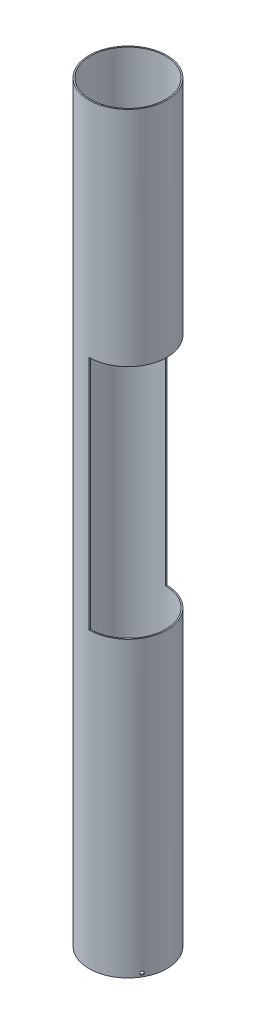
ISO-10303-21;
HEADER;
FILE_DESCRIPTION(('STEP AP214'),'2;1');
FILE_NAME('part.step','',(''),(''),'','','');
FILE_SCHEMA(('AUTOMOTIVE_DESIGN { 1 0 10303 214 1 1 1 1 }'));
ENDSEC;
DATA;
#1=APPLICATION_CONTEXT('core data for automotive mechanical design processes');
#2=APPLICATION_PROTOCOL_DEFINITION('international standard','automotive_design',2000,#1);
#3=PRODUCT_CONTEXT('',#1,'mechanical');
#4=PRODUCT('Part','Part','',(#3));
#5=PRODUCT_RELATED_PRODUCT_CATEGORY('part','',(#4));
#6=PRODUCT_DEFINITION_FORMATION('','',#4);
#7=PRODUCT_DEFINITION_CONTEXT('part definition',#1,'design');
#8=PRODUCT_DEFINITION('design','',#6,#7);
#9=PRODUCT_DEFINITION_SHAPE('','',#8);
#10=(LENGTH_UNIT() NAMED_UNIT(*) SI_UNIT(.MILLI.,.METRE.));
#11=(NAMED_UNIT(*) PLANE_ANGLE_UNIT() SI_UNIT($,.RADIAN.));
#12=(NAMED_UNIT(*) SI_UNIT($,.STERADIAN.) SOLID_ANGLE_UNIT());
#13=UNCERTAINTY_MEASURE_WITH_UNIT(LENGTH_MEASURE(1.E-05),#10,'distance_accuracy_value','');
#14=(GEOMETRIC_REPRESENTATION_CONTEXT(3) GLOBAL_UNCERTAINTY_ASSIGNED_CONTEXT((#13)) GLOBAL_UNIT_ASSIGNED_CONTEXT((#10,
#11,#12)) REPRESENTATION_CONTEXT('',''));
#15=CARTESIAN_POINT('',(0.,0.,0.));
#16=DIRECTION('',(0.,0.,1.));
#17=DIRECTION('',(1.,0.,0.));
#18=AXIS2_PLACEMENT_3D('',#15,#16,#17);
#19=CARTESIAN_POINT('',(0.,762.,0.));
#20=DIRECTION('',(0.,-1.,0.));
#21=DIRECTION('',(0.,0.,-1.));
#22=AXIS2_PLACEMENT_3D('',#19,#20,#21);
#23=CYLINDRICAL_SURFACE('',#22,39.37);
#24=CARTESIAN_POINT('',(0.,0.,0.));
#25=DIRECTION('',(0.,1.,0.));
#26=DIRECTION('',(0.,0.,1.));
#27=AXIS2_PLACEMENT_3D('',#24,#25,#26);
#28=CIRCLE('',#27,39.37);
#29=CARTESIAN_POINT('',(0.,0.,39.37));
#30=VERTEX_POINT('',#29);
#31=EDGE_CURVE('E172',#30,#30,#28,.T.);
#32=ORIENTED_EDGE('',*,*,#31,.T.);
#33=EDGE_LOOP('',(#32));
#34=FACE_BOUND('',#33,.T.);
#35=CARTESIAN_POINT('',(0.,762.,0.));
#36=DIRECTION('',(0.,1.,0.));
#37=DIRECTION('',(0.,0.,1.));
#38=AXIS2_PLACEMENT_3D('',#35,#36,#37);
#39=CIRCLE('',#38,39.37);
#40=CARTESIAN_POINT('',(0.,762.,39.37));
#41=VERTEX_POINT('',#40);
#42=EDGE_CURVE('E176',#41,#41,#39,.T.);
#43=ORIENTED_EDGE('',*,*,#42,.F.);
#44=EDGE_LOOP('',(#43));
#45=FACE_BOUND('',#44,.T.);
#46=CARTESIAN_POINT('',(0.,4.98001203184509,-39.37));
#47=CARTESIAN_POINT('',(-0.0950420783106642,4.98000783183179,-39.3699995116633));
#48=CARTESIAN_POINT('',(-0.19015195208346,4.97198129213131,-39.3696521537289));
#49=CARTESIAN_POINT('',(-0.377749092701281,4.94007502605946,-39.3682998672944));
#50=CARTESIAN_POINT('',(-0.470233116585823,4.91617651595078,-39.3672941596883));
#51=CARTESIAN_POINT('',(-0.649833808346389,4.85321079913397,-39.36473902938));
#52=CARTESIAN_POINT('',(-0.736953141689522,4.81415119689102,-39.3631898792939));
#53=CARTESIAN_POINT('',(-0.90337461556956,4.72198342848802,-39.3597224451632));
#54=CARTESIAN_POINT('',(-0.98267862079702,4.66887862462239,-39.3578042494948));
#55=CARTESIAN_POINT('',(-1.13130445742555,4.55008091395807,-39.3538129080837));
#56=CARTESIAN_POINT('',(-1.20061945247711,4.48437945716689,-39.3517396576837));
#57=CARTESIAN_POINT('',(-1.3272415925757,4.34227003364836,-39.3476727832543));
#58=CARTESIAN_POINT('',(-1.38454825216813,4.26586163428542,-39.3456791624467));
#59=CARTESIAN_POINT('',(-1.48554392473161,4.10447388206962,-39.3419956723313));
#60=CARTESIAN_POINT('',(-1.52922789130311,4.01949136840869,-39.340305915685));
#61=CARTESIAN_POINT('',(-1.60170568623785,3.84339004313634,-39.3374219044769));
#62=CARTESIAN_POINT('',(-1.63049960587457,3.75227126914304,-39.3362276468776));
#63=CARTESIAN_POINT('',(-1.67236268409085,3.56654421262905,-39.3344702061846));
#64=CARTESIAN_POINT('',(-1.68544164712472,3.47193814382548,-39.3339066296283));
#65=CARTESIAN_POINT('',(-1.69553378679414,3.28187174755947,-39.3334729195219));
#66=CARTESIAN_POINT('',(-1.69254706470368,3.1864114254858,-39.3336027816005));
#67=CARTESIAN_POINT('',(-1.67060081093584,2.99741286670702,-39.3345409385238));
#68=CARTESIAN_POINT('',(-1.65165186894738,2.90387339780013,-39.3353487835783));
#69=CARTESIAN_POINT('',(-1.59833546790773,2.72130431420434,-39.3375511396038));
#70=CARTESIAN_POINT('',(-1.56396795637497,2.63227471486722,-39.3389456525716));
#71=CARTESIAN_POINT('',(-1.4807778608903,2.46121846161553,-39.3421646783245));
#72=CARTESIAN_POINT('',(-1.43195043808114,2.37919416380863,-39.3439893350109));
#73=CARTESIAN_POINT('',(-1.32123009378693,2.22450267013418,-39.3478628287787));
#74=CARTESIAN_POINT('',(-1.25933710545153,2.15183552214581,-39.349911667007));
#75=CARTESIAN_POINT('',(-1.12418272987786,2.0178594309771,-39.3540045835823));
#76=CARTESIAN_POINT('',(-1.05091216873308,1.9565597418437,-39.3560486567252));
#77=CARTESIAN_POINT('',(-0.89511481475696,1.8471299233649,-39.3599000384661));
#78=CARTESIAN_POINT('',(-0.81258802000479,1.79899979675243,-39.3617073470151));
#79=CARTESIAN_POINT('',(-0.64061552136329,1.71727628329349,-39.3648815506819));
#80=CARTESIAN_POINT('',(-0.551169669949889,1.68368320649822,-39.3662484364061));
#81=CARTESIAN_POINT('',(-0.367900459757485,1.63199336734538,-39.3683875892833));
#82=CARTESIAN_POINT('',(-0.274077125262604,1.61389651903312,-39.3691598597346));
#83=CARTESIAN_POINT('',(-0.0847966155301952,1.59372421854097,-39.3700223156438));
#84=CARTESIAN_POINT('',(0.0106591929554708,1.59163596412215,-39.3701130461352));
#85=CARTESIAN_POINT('',(0.200565637148675,1.60350673879702,-39.3696036416406));
#86=CARTESIAN_POINT('',(0.295016275300036,1.61746572886681,-39.3690035083348));
#87=CARTESIAN_POINT('',(0.480195476070679,1.66102415267996,-39.3671803383439));
#88=CARTESIAN_POINT('',(0.570925413063392,1.69061775410989,-39.3659575339454));
#89=CARTESIAN_POINT('',(0.746130008305633,1.76459943479582,-39.3630267413466));
#90=CARTESIAN_POINT('',(0.830604640035484,1.80898757676962,-39.3613187510894));
#91=CARTESIAN_POINT('',(0.990959546892861,1.91133117994094,-39.3576084769163));
#92=CARTESIAN_POINT('',(1.06683433136313,1.96929523721227,-39.3556060068403));
#93=CARTESIAN_POINT('',(1.20778055703025,2.09713270074688,-39.3515329775977));
#94=CARTESIAN_POINT('',(1.27285194594558,2.16700616464075,-39.3494624181017));
#95=CARTESIAN_POINT('',(1.39038720966608,2.31673398284631,-39.3454850513226));
#96=CARTESIAN_POINT('',(1.44284281120277,2.39659483486953,-39.3435783520206));
#97=CARTESIAN_POINT('',(1.53360094179633,2.56399753766406,-39.3401453943536));
#98=CARTESIAN_POINT('',(1.57190352041913,2.65153936153417,-39.3386191346563));
#99=CARTESIAN_POINT('',(1.63325387152443,2.83178816474908,-39.3361199248937));
#100=CARTESIAN_POINT('',(1.65630694977704,2.9244933354223,-39.3351467823986));
#101=CARTESIAN_POINT('',(1.68652127447177,3.11246268625176,-39.33386299577));
#102=CARTESIAN_POINT('',(1.69368258004302,3.20772685688532,-39.3335523491714));
#103=CARTESIAN_POINT('',(1.69190946940816,3.39802755639757,-39.333628650755));
#104=CARTESIAN_POINT('',(1.68298807591869,3.49306420711711,-39.3340150345277));
#105=CARTESIAN_POINT('',(1.64932968820657,3.68028926657918,-39.3354406540112));
#106=CARTESIAN_POINT('',(1.62459266328724,3.77247766979317,-39.3364798909891));
#107=CARTESIAN_POINT('',(1.56000766284437,3.9513926152622,-39.3390939598741));
#108=CARTESIAN_POINT('',(1.52015950497137,4.03811909159221,-39.3406687982445));
#109=CARTESIAN_POINT('',(1.42648607612367,4.20365089531175,-39.3441765014396));
#110=CARTESIAN_POINT('',(1.37266126509872,4.28245648324695,-39.3461093544819));
#111=CARTESIAN_POINT('',(1.25251738996995,4.42997353540114,-39.3501169655678));
#112=CARTESIAN_POINT('',(1.18618958482348,4.49867787750174,-39.3521918222379));
#113=CARTESIAN_POINT('',(1.0429219433514,4.6239967145901,-39.3562490325377));
#114=CARTESIAN_POINT('',(0.965979493562689,4.68060822339067,-39.3582313632249));
#115=CARTESIAN_POINT('',(0.803618694279619,4.78015395567005,-39.3618812018049));
#116=CARTESIAN_POINT('',(0.718193353798812,4.82307677316331,-39.3635484466865));
#117=CARTESIAN_POINT('',(0.541406294233834,4.89392001699157,-39.3663760344494));
#118=CARTESIAN_POINT('',(0.450051759273257,4.92185823262782,-39.3675369780901));
#119=CARTESIAN_POINT('',(0.298438107295841,4.95458011910427,-39.3689127721565));
#120=CARTESIAN_POINT('',(0.239161885859798,4.96410498233784,-39.3693187000876));
#121=CARTESIAN_POINT('',(0.119932776340874,4.97682226203223,-39.3698624680178));
#122=CARTESIAN_POINT('',(0.0599798886778428,4.98001468242191,-39.3700003081833));
#123=CARTESIAN_POINT('',(0.,4.98001203184509,-39.37));
#124=B_SPLINE_CURVE_WITH_KNOTS('',3,(#46,#47,#48,#49,#50,#51,#52,#53,#54,#55,#56,#57,#58,#59,
#60,#61,#62,#63,#64,#65,#66,#67,#68,#69,#70,#71,#72,#73,#74,#75,#76,#77,#78,#79,#80,#81,#82,#83,
#84,#85,#86,#87,#88,#89,#90,#91,#92,#93,#94,#95,#96,#97,#98,#99,#100,#101,#102,#103,#104,#105,
#106,#107,#108,#109,#110,#111,#112,#113,#114,#115,#116,#117,#118,#119,#120,#121,#122,#123),
.UNSPECIFIED.,.T.,.F.,(4,2,2,2,2,2,2,2,2,2,2,2,2,2,2,2,2,2,2,2,2,2,2,2,2,2,2,2,2,2,2,2,2,2,2,2,
2,2,4),(0.,0.284907291951242,0.570152360661547,0.855254541313081,1.14028853275696,
1.42551668068289,1.71075635715183,1.99610157282346,2.28144503935619,2.56661038945319,
2.85177394194247,3.1367484594956,3.42172394704963,3.70679490662229,3.99186732480409,
4.27717080625707,4.56247434691592,4.84778397232727,5.13309201516931,5.4181718703784,
5.70325103232804,5.98822392376052,6.2731980232806,6.55835305445107,6.84350946554916,
7.12885237168492,7.41419427849897,7.69943685379749,7.98467836778141,8.26968901560107,
8.55470021660186,8.83971485700698,9.12472011921539,9.40992537713639,9.69520098203275,
9.98071367307523,10.2658866569249,10.4456882622863,10.6254897560929),.UNSPECIFIED.);
#125=CARTESIAN_POINT('',(0.,4.98001203184509,-39.37));
#126=VERTEX_POINT('',#125);
#127=EDGE_CURVE('E180',#126,#126,#124,.T.);
#128=ORIENTED_EDGE('',*,*,#127,.T.);
#129=EDGE_LOOP('',(#128));
#130=FACE_BOUND('',#129,.T.);
#131=CARTESIAN_POINT('',(33.2174512961359,3.28714288487833,21.1328613630251));
#132=CARTESIAN_POINT('',(33.2174538205479,3.38218491738494,21.1328579706893));
#133=CARTESIAN_POINT('',(33.2217681930752,3.47729474551065,21.126080633747));
#134=CARTESIAN_POINT('',(33.2388934445685,3.6648917912808,21.0991257570981));
#135=CARTESIAN_POINT('',(33.2517143907443,3.75737576592903,21.0789323399275));
#136=CARTESIAN_POINT('',(33.2854116163837,3.9369763536157,21.02568097877));
#137=CARTESIAN_POINT('',(33.3062838568314,4.02409563253836,20.9926294851009));
#138=CARTESIAN_POINT('',(33.3553720391397,4.19051701538223,20.9145445214253));
#139=CARTESIAN_POINT('',(33.3835862234407,4.26982098392493,20.8695139189942));
#140=CARTESIAN_POINT('',(33.4464423518298,4.4184468625803,20.7686282179428));
#141=CARTESIAN_POINT('',(33.4810886687199,4.48776192457972,20.7127657542666));
#142=CARTESIAN_POINT('',(33.5556650540467,4.61438419371642,20.5917285571402));
#143=CARTESIAN_POINT('',(33.5955953358989,4.67169091560414,20.5265534475506));
#144=CARTESIAN_POINT('',(33.6794779391566,4.77268665284044,20.3886285247867));
#145=CARTESIAN_POINT('',(33.7234317398689,4.81637063336175,20.3158759242693));
#146=CARTESIAN_POINT('',(33.8139783769478,4.88884845770009,20.1648087872665));
#147=CARTESIAN_POINT('',(33.8605711971658,4.91764239262118,20.0864942848148));
#148=CARTESIAN_POINT('',(33.9549554225056,4.95950550347214,19.9265279617717));
#149=CARTESIAN_POINT('',(34.0027460612068,4.97258448495485,19.8448782551491));
#150=CARTESIAN_POINT('',(34.0981544914141,4.98267667167345,19.680492633966));
#151=CARTESIAN_POINT('',(34.1457722840059,4.97968997798896,19.5977567262428));
#152=CARTESIAN_POINT('',(34.2394598912068,4.95774376868586,19.4336104076742));
#153=CARTESIAN_POINT('',(34.2855307083884,4.93879481417567,19.3521991566899));
#154=CARTESIAN_POINT('',(34.37490958429,4.88547833548628,19.1929891139188));
#155=CARTESIAN_POINT('',(34.4182176336554,4.85111075910423,19.1151903343637));
#156=CARTESIAN_POINT('',(34.5009596753003,4.76792053040032,18.9654425262297));
#157=CARTESIAN_POINT('',(34.5403923689781,4.71909305452594,18.8934954598974));
#158=CARTESIAN_POINT('',(34.6143845938184,4.60837259753722,18.7575924822923));
#159=CARTESIAN_POINT('',(34.6489441000329,4.5464795495389,18.6936366119299));
#160=CARTESIAN_POINT('',(34.7123875129296,4.4113251322666,18.5755634988489));
#161=CARTESIAN_POINT('',(34.7412668026752,4.33805460110622,18.5214542622221));
#162=CARTESIAN_POINT('',(34.7926452104451,4.18225733210706,18.4247590777228));
#163=CARTESIAN_POINT('',(34.8151443270767,4.09973059224792,18.3821731323654));
#164=CARTESIAN_POINT('',(34.8532555182368,3.92775810714328,18.3098105015829));
#165=CARTESIAN_POINT('',(34.8688674373111,3.83831220577562,18.2800341052886));
#166=CARTESIAN_POINT('',(34.8928583269078,3.6550428872034,18.2341989882741));
#167=CARTESIAN_POINT('',(34.9012373376876,3.56121949436637,18.2181401912038));
#168=CARTESIAN_POINT('',(34.9105758749707,3.37193895962708,18.2002389044854));
#169=CARTESIAN_POINT('',(34.9115413375262,3.27648318617466,18.1983850409036));
#170=CARTESIAN_POINT('',(34.9060474900208,3.08657681934583,18.208920411737));
#171=CARTESIAN_POINT('',(34.899588198014,2.99212622352577,18.2213096115186));
#172=CARTESIAN_POINT('',(34.879389207629,2.80694722254543,18.2599446463407));
#173=CARTESIAN_POINT('',(34.8656522323883,2.71621743881703,18.2861852984811));
#174=CARTESIAN_POINT('',(34.831201232923,2.54101313126621,18.3517215337401));
#175=CARTESIAN_POINT('',(34.8104871790039,2.45653863406829,18.391017172421));
#176=CARTESIAN_POINT('',(34.7625298844432,2.29618381557865,18.4815050721675));
#177=CARTESIAN_POINT('',(34.7352824952791,2.22030900015793,18.5327048914938));
#178=CARTESIAN_POINT('',(34.6748914378453,2.07936270340621,18.6454520636411));
#179=CARTESIAN_POINT('',(34.6417477411147,2.01429127422503,18.7069994664088));
#180=CARTESIAN_POINT('',(34.5703275693102,1.89675592818081,18.8386558243499));
#181=CARTESIAN_POINT('',(34.5320477514916,1.84430028467192,18.9087703525935));
#182=CARTESIAN_POINT('',(34.4513179067664,1.75354208033435,19.0554610035425));
#183=CARTESIAN_POINT('',(34.4088678944655,1.71523946993862,19.1320371036169));
#184=CARTESIAN_POINT('',(34.3209062996509,1.6538890967604,19.2893858168249));
#185=CARTESIAN_POINT('',(34.2753957908424,1.63083601447108,19.3701569559842));
#186=CARTESIAN_POINT('',(34.1825219936844,1.6006216620792,19.533584414318));
#187=CARTESIAN_POINT('',(34.1351587121937,1.59346033315357,19.6162407265134));
#188=CARTESIAN_POINT('',(34.0399423248748,1.59523337767018,19.7810078905008));
#189=CARTESIAN_POINT('',(33.9920896455457,1.60415475616211,19.8631191289154));
#190=CARTESIAN_POINT('',(33.8972434528362,1.63781315173865,20.0245487830765));
#191=CARTESIAN_POINT('',(33.850249941113,1.66255019932711,20.1038671934362));
#192=CARTESIAN_POINT('',(33.758530117058,1.72713528475596,20.2575061608741));
#193=CARTESIAN_POINT('',(33.7138038320892,1.76698350492273,20.3318266576365));
#194=CARTESIAN_POINT('',(33.6280015194782,1.86065709050227,20.4734285430828));
#195=CARTESIAN_POINT('',(33.5869253717463,1.91448199585274,20.540710163359));
#196=CARTESIAN_POINT('',(33.5096968051586,2.03462597249464,20.6664602377637));
#197=CARTESIAN_POINT('',(33.4735478530767,2.10095376341906,20.7249224896427));
#198=CARTESIAN_POINT('',(33.4073744260692,2.2442213476446,20.8314228152268));
#199=CARTESIAN_POINT('',(33.3773514640614,2.32116375456164,20.8794583140535));
#200=CARTESIAN_POINT('',(33.3244164552602,2.48352452120396,20.9638417046183));
#201=CARTESIAN_POINT('',(33.301510345427,2.56894987953958,21.0001798391867));
#202=CARTESIAN_POINT('',(33.2636383410865,2.74573697740927,21.0601171211081));
#203=CARTESIAN_POINT('',(33.2486630314987,2.83709153272086,21.0837313742503));
#204=CARTESIAN_POINT('',(33.2311096380607,2.98870513701385,21.1113808381931));
#205=CARTESIAN_POINT('',(33.2259953610197,3.04798128677177,21.1194264469216));
#206=CARTESIAN_POINT('',(33.2191653945528,3.16721025258049,21.1301677781028));
#207=CARTESIAN_POINT('',(33.2174497030117,3.22716306821015,21.132863503885));
#208=CARTESIAN_POINT('',(33.2174512961359,3.28714288487833,21.1328613630251));
#209=B_SPLINE_CURVE_WITH_KNOTS('',3,(#131,#132,#133,#134,#135,#136,#137,#138,#139,#140,#141,
#142,#143,#144,#145,#146,#147,#148,#149,#150,#151,#152,#153,#154,#155,#156,#157,#158,#159,#160,
#161,#162,#163,#164,#165,#166,#167,#168,#169,#170,#171,#172,#173,#174,#175,#176,#177,#178,#179,
#180,#181,#182,#183,#184,#185,#186,#187,#188,#189,#190,#191,#192,#193,#194,#195,#196,#197,#198,
#199,#200,#201,#202,#203,#204,#205,#206,#207,#208),.UNSPECIFIED.,.T.,.F.,(4,2,2,2,2,2,2,2,2,2,2,
2,2,2,2,2,2,2,2,2,2,2,2,2,2,2,2,2,2,2,2,2,2,2,2,2,2,2,4),(0.,0.284907154392816,
0.570152088539903,0.855254112292125,1.14028794925074,1.42551627711697,1.71075612866084,
1.99610127736488,2.28144468017745,2.56660994659131,2.85177341884691,3.1367483664877,
3.42172427897576,3.70679536139441,3.99186790315575,4.27717120578255,4.56247457068296,
4.84778437497278,5.13309259126105,5.4181723364922,5.70325138852219,5.98822384595427,
6.27319751625019,6.55835261992712,6.84350910005751,7.12885207722146,7.41419405504167,
7.69943644419612,7.9846777775289,8.26968873698255,8.55470024614147,8.83971519426367,
9.12472076190602,9.40992583553519,9.69520126040553,9.98071403029439,10.2658870884428,
10.4456884781288,10.6254897559134),.UNSPECIFIED.);
#210=CARTESIAN_POINT('',(33.2174512961359,3.28714288487833,21.1328613630251));
#211=VERTEX_POINT('',#210);
#212=EDGE_CURVE('E102',#211,#211,#209,.T.);
#213=ORIENTED_EDGE('',*,*,#212,.T.);
#214=EDGE_LOOP('',(#213));
#215=FACE_BOUND('',#214,.T.);
#216=CARTESIAN_POINT('',(-34.9103204431024,3.28714288487833,18.2007259899133));
#217=CARTESIAN_POINT('',(-34.9103187674594,3.38218491738494,18.2007298722861));
#218=CARTESIAN_POINT('',(-34.906606607761,3.47729474551065,18.2078548969673));
#219=CARTESIAN_POINT('',(-34.8918256255739,3.6648917912808,18.2361632381312));
#220=CARTESIAN_POINT('',(-34.8807480864028,3.75737576592903,18.2573632118053));
#221=CARTESIAN_POINT('',(-34.851479667674,3.9369763536157,18.3131715458248));
#222=CARTESIAN_POINT('',(-34.8332923547473,4.02409563253836,18.3477731831209));
#223=CARTESIAN_POINT('',(-34.7902128837049,4.19051701538223,18.4293272778634));
#224=CARTESIAN_POINT('',(-34.7653223302024,4.26982098392493,18.4762767794306));
#225=CARTESIAN_POINT('',(-34.7093808144077,4.4184468625803,18.5811546339248));
#226=CARTESIAN_POINT('',(-34.6783256601913,4.48776192457972,18.6390904563373));
#227=CARTESIAN_POINT('',(-34.6107925653403,4.61438419371642,18.764194099116));
#228=CARTESIAN_POINT('',(-34.5743144056674,4.67169091560414,18.831362292375));
#229=CARTESIAN_POINT('',(-34.4968092203678,4.77268665284044,18.9729692191137));
#230=CARTESIAN_POINT('',(-34.4557805204844,4.81637063336175,19.0474106273821));
#231=CARTESIAN_POINT('',(-34.3702258607025,4.88884845770009,19.2013598838211));
#232=CARTESIAN_POINT('',(-34.3256999222036,4.91764239262118,19.2808677009896));
#233=CARTESIAN_POINT('',(-34.2343571353681,4.95950550347214,19.4425899993721));
#234=CARTESIAN_POINT('',(-34.187541734572,4.97258448495485,19.5248027598616));
#235=CARTESIAN_POINT('',(-34.0928838257142,4.98267667167345,19.6896216947479));
#236=CARTESIAN_POINT('',(-34.0450413241167,4.97968997798896,19.7722278666661));
#237=CARTESIAN_POINT('',(-33.949730245899,4.95774376868586,19.9354368738062));
#238=CARTESIAN_POINT('',(-33.9022614429835,4.93879481417567,20.0160409973508));
#239=CARTESIAN_POINT('',(-33.8090709393569,4.88547833548627,20.1730503958287));
#240=CARTESIAN_POINT('',(-33.7633492445615,4.85111075910423,20.2494556565451));
#241=CARTESIAN_POINT('',(-33.6750348593789,4.76792053040032,20.3959862706376));
#242=CARTESIAN_POINT('',(-33.6324432190463,4.71909305452594,20.4661095182684));
#243=CARTESIAN_POINT('',(-33.5517439004104,4.60837259753722,20.5981401534651));
#244=CARTESIAN_POINT('',(-33.5136362450627,4.5464795495389,20.6600474989703));
#245=CARTESIAN_POINT('',(-33.443103636079,4.4113251322666,20.7740276627822));
#246=CARTESIAN_POINT('',(-33.4106833074537,4.33805460110622,20.8260924796585));
#247=CARTESIAN_POINT('',(-33.3526320251385,4.18225733210706,20.9189350782428));
#248=CARTESIAN_POINT('',(-33.3270010729306,4.09973059224792,20.9597128574872));
#249=CARTESIAN_POINT('',(-33.2833887919683,3.92775810714328,21.0288994325916));
#250=CARTESIAN_POINT('',(-33.2654076358815,3.83831220577562,21.0573079492589));
#251=CARTESIAN_POINT('',(-33.2377087049599,3.6550428872034,21.1010022276163));
#252=CARTESIAN_POINT('',(-33.2279908841327,3.56121949436637,21.1162880623453));
#253=CARTESIAN_POINT('',(-33.2171571837157,3.37193895962708,21.133326116226));
#254=CARTESIAN_POINT('',(-33.2160344220365,3.27648318617467,21.1350891631163));
#255=CARTESIAN_POINT('',(-33.2224113970638,3.08657681934583,21.1250636661954));
#256=CARTESIAN_POINT('',(-33.2299111128037,2.99212622352577,21.1132751553363));
#257=CARTESIAN_POINT('',(-33.2532705392433,2.80694722254543,21.076464799121));
#258=CARTESIAN_POINT('',(-33.2691271229884,2.71621743881703,21.0514479035212));
#259=CARTESIAN_POINT('',(-33.3086576678585,2.54101313126621,20.988844345169));
#260=CARTESIAN_POINT('',(-33.3323316622545,2.45653863406829,20.9512576289193));
#261=CARTESIAN_POINT('',(-33.3867178348898,2.29618381557865,20.8644814436597));
#262=CARTESIAN_POINT('',(-33.4174344845134,2.22030900015793,20.8152846027935));
#263=CARTESIAN_POINT('',(-33.4848808710809,2.07936270340621,20.7066108268208));
#264=CARTESIAN_POINT('',(-33.5216106370494,2.01429127422503,20.6471338420929));
#265=CARTESIAN_POINT('',(-33.5999183016939,1.89675592818081,20.519453979997));
#266=CARTESIAN_POINT('',(-33.6414993554179,1.84430028467192,20.4512454211921));
#267=CARTESIAN_POINT('',(-33.7281722632748,1.75354208033435,20.307985999342));
#268=CARTESIAN_POINT('',(-33.7732641051115,1.71523946993862,20.2329351602613));
#269=CARTESIAN_POINT('',(-33.8655512905951,1.6538890967604,20.0780838279904));
#270=CARTESIAN_POINT('',(-33.9127458945955,1.63083601447108,19.9982850016434));
#271=CARTESIAN_POINT('',(-34.0078413266095,1.6006216620792,19.8361402047918));
#272=CARTESIAN_POINT('',(-34.0557421520085,1.59346033315357,19.7537942437166));
#273=CARTESIAN_POINT('',(-34.1508265080716,1.59523337767018,19.5889508514481));
#274=CARTESIAN_POINT('',(-34.1980105868103,1.60415475616211,19.5064535963027));
#275=CARTESIAN_POINT('',(-34.2903896718832,1.63781315173865,19.3435995568835));
#276=CARTESIAN_POINT('',(-34.3355846743809,1.66255019932711,19.2632427767383));
#277=CARTESIAN_POINT('',(-34.4227800111659,1.72713528475596,19.1069915953571));
#278=CARTESIAN_POINT('',(-34.4647803068996,1.76698350492273,19.031097247976));
#279=CARTESIAN_POINT('',(-34.5445099806143,1.86065709050227,18.8859893228283));
#280=CARTESIAN_POINT('',(-34.5822394991153,1.91448199585274,18.8167755252648));
#281=CARTESIAN_POINT('',(-34.6525279747838,2.03462597249464,18.6870185874995));
#282=CARTESIAN_POINT('',(-34.6850832940325,2.10095376341906,18.626481550737));
#283=CARTESIAN_POINT('',(-34.7442285679959,2.2442213476446,18.5159235191009));
#284=CARTESIAN_POINT('',(-34.7708170492594,2.32116375456164,18.465905121892));
#285=CARTESIAN_POINT('',(-34.8174277047453,2.48352452120395,18.3778703642382));
#286=CARTESIAN_POINT('',(-34.837444397491,2.56894987953958,18.3398640239366));
#287=CARTESIAN_POINT('',(-34.8704156040986,2.74573697740927,18.2770972651248));
#288=CARTESIAN_POINT('',(-34.8833784924172,2.83709153272086,18.2523211400211));
#289=CARTESIAN_POINT('',(-34.8985469338737,2.98870513701385,18.2232947234098));
#290=CARTESIAN_POINT('',(-34.902957496901,3.04798128677177,18.214842825206));
#291=CARTESIAN_POINT('',(-34.9088447793408,3.1672102525805,18.2035572351481));
#292=CARTESIAN_POINT('',(-34.9103215005794,3.22716306821015,18.2007235397973));
#293=CARTESIAN_POINT('',(-34.9103204431024,3.28714288487833,18.2007259899133));
#294=B_SPLINE_CURVE_WITH_KNOTS('',3,(#216,#217,#218,#219,#220,#221,#222,#223,#224,#225,#226,
#227,#228,#229,#230,#231,#232,#233,#234,#235,#236,#237,#238,#239,#240,#241,#242,#243,#244,#245,
#246,#247,#248,#249,#250,#251,#252,#253,#254,#255,#256,#257,#258,#259,#260,#261,#262,#263,#264,
#265,#266,#267,#268,#269,#270,#271,#272,#273,#274,#275,#276,#277,#278,#279,#280,#281,#282,#283,
#284,#285,#286,#287,#288,#289,#290,#291,#292,#293),.UNSPECIFIED.,.T.,.F.,(4,2,2,2,2,2,2,2,2,2,2,
2,2,2,2,2,2,2,2,2,2,2,2,2,2,2,2,2,2,2,2,2,2,2,2,2,2,2,4),(0.,0.284907154392816,
0.570152088539902,0.855254112292124,1.14028794925074,1.42551627711697,1.71075612866084,
1.99610127736487,2.28144468017746,2.56660994659132,2.85177341884692,3.13674836648771,
3.42172427897577,3.70679536139442,3.99186790315575,4.27717120578255,4.56247457068296,
4.84778437497278,5.13309259126105,5.4181723364922,5.70325138852219,5.98822384595427,
6.27319751625019,6.55835261992713,6.84350910005751,7.12885207722146,7.41419405504167,
7.69943644419613,7.9846777775289,8.26968873698256,8.55470024614147,8.83971519426367,
9.12472076190603,9.40992583553519,9.69520126040553,9.98071403029439,10.2658870884428,
10.4456884781288,10.6254897559134),.UNSPECIFIED.);
#295=CARTESIAN_POINT('',(-34.9103204431024,3.28714288487833,18.2007259899133));
#296=VERTEX_POINT('',#295);
#297=EDGE_CURVE('E110',#296,#296,#294,.T.);
#298=ORIENTED_EDGE('',*,*,#297,.T.);
#299=EDGE_LOOP('',(#298));
#300=FACE_BOUND('',#299,.T.);
#301=DIRECTION('',(0.,-1.,0.));
#302=VECTOR('',#301,1.);
#303=CARTESIAN_POINT('',(0.,762.,39.37));
#304=LINE('',#303,#302);
#305=CARTESIAN_POINT('',(0.,536.312213743687,39.37));
#306=VERTEX_POINT('',#305);
#307=CARTESIAN_POINT('',(0.,297.159690808748,39.37));
#308=VERTEX_POINT('',#307);
#309=EDGE_CURVE('E83',#306,#308,#304,.T.);
#310=ORIENTED_EDGE('',*,*,#309,.F.);
#311=CARTESIAN_POINT('',(0.,536.312213743687,0.));
#312=DIRECTION('',(0.,-1.,0.));
#313=DIRECTION('',(0.,0.,-1.));
#314=AXIS2_PLACEMENT_3D('',#311,#312,#313);
#315=CIRCLE('',#314,39.37);
#316=CARTESIAN_POINT('',(0.,536.312213743687,-39.37));
#317=VERTEX_POINT('',#316);
#318=EDGE_CURVE('E88',#317,#306,#315,.T.);
#319=ORIENTED_EDGE('',*,*,#318,.F.);
#320=DIRECTION('',(0.,-1.,0.));
#321=VECTOR('',#320,1.);
#322=CARTESIAN_POINT('',(0.,762.,-39.37));
#323=LINE('',#322,#321);
#324=CARTESIAN_POINT('',(0.,297.159690808748,-39.37));
#325=VERTEX_POINT('',#324);
#326=EDGE_CURVE('E78',#325,#317,#323,.F.);
#327=ORIENTED_EDGE('',*,*,#326,.F.);
#328=CARTESIAN_POINT('',(0.,297.159690808748,0.));
#329=DIRECTION('',(0.,1.,0.));
#330=DIRECTION('',(0.,0.,1.));
#331=AXIS2_PLACEMENT_3D('',#328,#329,#330);
#332=CIRCLE('',#331,39.37);
#333=EDGE_CURVE('E96',#308,#325,#332,.T.);
#334=ORIENTED_EDGE('',*,*,#333,.F.);
#335=EDGE_LOOP('',(#310,#319,#327,#334));
#336=FACE_BOUND('',#335,.T.);
#337=ADVANCED_FACE('F40',(#34,#45,#130,#215,#300,#336),#23,.T.);
#338=CARTESIAN_POINT('',(0.,762.,0.));
#339=DIRECTION('',(0.,-1.,0.));
#340=DIRECTION('',(0.,0.,-1.));
#341=AXIS2_PLACEMENT_3D('',#338,#339,#340);
#342=CYLINDRICAL_SURFACE('',#341,38.1);
#343=CARTESIAN_POINT('',(-33.8094160153741,3.28714288487833,17.5651185222123));
#344=CARTESIAN_POINT('',(-33.8094143543288,3.38218171940621,17.5651224116475));
#345=CARTESIAN_POINT('',(-33.8057124993749,3.47728827138197,17.5722527645965));
#346=CARTESIAN_POINT('',(-33.7909717083435,3.66487863560934,17.6005816987345));
#347=CARTESIAN_POINT('',(-33.7799240881283,3.75735920834741,17.6217969309731));
#348=CARTESIAN_POINT('',(-33.7507318963243,3.93695297469838,17.6776436072991));
#349=CARTESIAN_POINT('',(-33.7325908945791,4.02406884268773,17.7122683028025));
#350=CARTESIAN_POINT('',(-33.6896153878106,4.19048407914288,17.793873419736));
#351=CARTESIAN_POINT('',(-33.6647824804593,4.26978530716657,17.8408508919135));
#352=CARTESIAN_POINT('',(-33.6089602010448,4.41840984755649,17.9457883133733));
#353=CARTESIAN_POINT('',(-33.5779663999485,4.48772591945836,18.0037561621849));
#354=CARTESIAN_POINT('',(-33.5105536276877,4.61435094283753,18.1289226827243));
#355=CARTESIAN_POINT('',(-33.4741344369646,4.67165940815599,18.1961217280185));
#356=CARTESIAN_POINT('',(-33.3967371011577,4.77266075250482,18.3377877223142));
#357=CARTESIAN_POINT('',(-33.3557571587441,4.8163482377267,18.4122575351968));
#358=CARTESIAN_POINT('',(-33.2702851206148,4.88883280444153,18.566256363971));
#359=CARTESIAN_POINT('',(-33.2257930473694,4.91762998119241,18.6457853474939));
#360=CARTESIAN_POINT('',(-33.1345012139446,4.95949803368491,18.8075368757998));
#361=CARTESIAN_POINT('',(-33.0877030120023,4.97257938086054,18.8897575895234));
#362=CARTESIAN_POINT('',(-32.9930592616569,4.98267674704841,19.0545813470321));
#363=CARTESIAN_POINT('',(-32.9452137201636,4.97969287201821,19.1371843882919));
#364=CARTESIAN_POINT('',(-32.8498789990916,4.95775321464979,19.3003724287752));
#365=CARTESIAN_POINT('',(-32.8023895917886,4.93880870889598,19.3809588114367));
#366=CARTESIAN_POINT('',(-32.7091406148927,4.88550302673365,19.5379236234456));
#367=CARTESIAN_POINT('',(-32.6633810514267,4.85114179572601,19.6143020378892));
#368=CARTESIAN_POINT('',(-32.5749768863395,4.76796516527169,19.7607745155725));
#369=CARTESIAN_POINT('',(-32.5323334008888,4.71914461787257,19.8308663289938));
#370=CARTESIAN_POINT('',(-32.4515230945298,4.60843896285516,19.9628316015512));
#371=CARTESIAN_POINT('',(-32.4133562982144,4.54655378347126,20.0247050155396));
#372=CARTESIAN_POINT('',(-32.3427024898681,4.41141178428608,20.1386221655671));
#373=CARTESIAN_POINT('',(-32.3102204155867,4.33814518181172,20.1906573592482));
#374=CARTESIAN_POINT('',(-32.2520520220997,4.18235451337957,20.2834451964729));
#375=CARTESIAN_POINT('',(-32.226365704435,4.09983044532286,20.3241978374585));
#376=CARTESIAN_POINT('',(-32.1826551014858,3.92786157285979,20.3933418576518));
#377=CARTESIAN_POINT('',(-32.164631002952,3.83841659983362,20.4217329355727));
#378=CARTESIAN_POINT('',(-32.1368634226269,3.65514755994837,20.4654021395383));
#379=CARTESIAN_POINT('',(-32.1271198916347,3.56132351911199,20.4806803434961));
#380=CARTESIAN_POINT('',(-32.116255086806,3.3720455770027,20.4977136144868));
#381=CARTESIAN_POINT('',(-32.1151264477047,3.27659313792258,20.4994802331938));
#382=CARTESIAN_POINT('',(-32.1215111298582,3.08669244071317,20.4894742880325));
#383=CARTESIAN_POINT('',(-32.1290244286443,2.99224417997369,20.4777017593654));
#384=CARTESIAN_POINT('',(-32.1524282504509,2.80707123663987,20.4409350882779));
#385=CARTESIAN_POINT('',(-32.1683154255608,2.71634508154551,20.4159462297875));
#386=CARTESIAN_POINT('',(-32.2079203372339,2.54114641442029,20.3534083030556));
#387=CARTESIAN_POINT('',(-32.2316381094359,2.45667393085346,20.3158591776495));
#388=CARTESIAN_POINT('',(-32.2861208694576,2.2963174738089,20.2291624196945));
#389=CARTESIAN_POINT('',(-32.3168906364198,2.22043937710063,20.1800069208106));
#390=CARTESIAN_POINT('',(-32.3844454331766,2.07948468035869,20.0714167908587));
#391=CARTESIAN_POINT('',(-32.4212304938175,2.01440813571881,20.0119821070789));
#392=CARTESIAN_POINT('',(-32.4996463274479,1.89685793159992,19.8843805434919));
#393=CARTESIAN_POINT('',(-32.5412804673483,1.84439310732713,19.8162075930123));
#394=CARTESIAN_POINT('',(-32.6280497160245,1.75361601658056,19.6730112325568));
#395=CARTESIAN_POINT('',(-32.6731848119641,1.71530369821927,19.5979878476979));
#396=CARTESIAN_POINT('',(-32.7655426315996,1.65393463895175,19.4431820960052));
#397=CARTESIAN_POINT('',(-32.8127645716929,1.63087222282248,19.3634015116181));
#398=CARTESIAN_POINT('',(-32.9078965480536,1.6006390338024,19.2012805431304));
#399=CARTESIAN_POINT('',(-32.9558065815164,1.59346819615504,19.118940169462));
#400=CARTESIAN_POINT('',(-33.0508874048496,1.59522236985813,18.9540994911211));
#401=CARTESIAN_POINT('',(-33.098058796523,1.60413350764556,18.8715993855717));
#402=CARTESIAN_POINT('',(-33.1903945169769,1.63777003621175,18.7087273467006));
#403=CARTESIAN_POINT('',(-33.2355588419023,1.66249545736471,18.6283554174668));
#404=CARTESIAN_POINT('',(-33.3226782280633,1.72705601867957,18.4720634230048));
#405=CARTESIAN_POINT('',(-33.3646332531732,1.76689132889724,18.3961434078923));
#406=CARTESIAN_POINT('',(-33.4442631263542,1.86053812233139,18.2509760499012));
#407=CARTESIAN_POINT('',(-33.4819381134211,1.91434915149468,18.1817284903433));
#408=CARTESIAN_POINT('',(-33.552116602201,2.03446825423532,18.051895512812));
#409=CARTESIAN_POINT('',(-33.5846161811861,2.10078572476307,17.9913166688307));
#410=CARTESIAN_POINT('',(-33.6436533571872,2.24403418213553,17.8806748410163));
#411=CARTESIAN_POINT('',(-33.6701894823227,2.32096778167332,17.830614453513));
#412=CARTESIAN_POINT('',(-33.7167057370272,2.48331508295238,17.7424983244335));
#413=CARTESIAN_POINT('',(-33.7366802321291,2.56873599119792,17.7044529011761));
#414=CARTESIAN_POINT('',(-33.7695817920667,2.74551705756376,17.6416160113135));
#415=CARTESIAN_POINT('',(-33.7825172076443,2.83687003351814,17.6168088403184));
#416=CARTESIAN_POINT('',(-33.7976591812901,2.9885186077328,17.5877338778882));
#417=CARTESIAN_POINT('',(-33.8020635322326,3.04783124385015,17.5792645536546));
#418=CARTESIAN_POINT('',(-33.8079424727784,3.16713454664704,17.5679556495913));
#419=CARTESIAN_POINT('',(-33.8094170643355,3.22712521287441,17.5651160660074));
#420=CARTESIAN_POINT('',(-33.8094160153741,3.28714288487833,17.5651185222123));
#421=B_SPLINE_CURVE_WITH_KNOTS('',3,(#343,#344,#345,#346,#347,#348,#349,#350,#351,#352,#353,
#354,#355,#356,#357,#358,#359,#360,#361,#362,#363,#364,#365,#366,#367,#368,#369,#370,#371,#372,
#373,#374,#375,#376,#377,#378,#379,#380,#381,#382,#383,#384,#385,#386,#387,#388,#389,#390,#391,
#392,#393,#394,#395,#396,#397,#398,#399,#400,#401,#402,#403,#404,#405,#406,#407,#408,#409,#410,
#411,#412,#413,#414,#415,#416,#417,#418,#419,#420),.UNSPECIFIED.,.T.,.F.,(4,2,2,2,2,2,2,2,2,2,2,
2,2,2,2,2,2,2,2,2,2,2,2,2,2,2,2,2,2,2,2,2,2,2,2,2,2,2,4),(0.,0.284897421068616,
0.570132247117116,0.855223709117989,1.14024716660771,1.42547627182562,1.71071692304668,
1.99607038443798,2.28142202031205,2.56658342117854,2.8517429412762,3.13670115784063,
3.42166038360708,3.70672118565538,3.99178355361806,4.2770923109407,4.56240113295053,
4.84771690836882,5.13303098850811,5.41810111325181,5.70317049682575,5.98812599482824,
6.27308278974644,6.55823327417049,6.84338522089151,7.12873635388354,7.41408644067904,
7.69933027511054,7.98457294720043,8.26956966438797,8.55456692896495,8.83956740116733,
9.12455861522756,9.40976482218329,9.69504134570129,9.98056219949313,10.2657435858873,
10.4456583697757,10.6255730336855),.UNSPECIFIED.);
#422=CARTESIAN_POINT('',(-33.8094160153741,3.28714288487833,17.5651185222123));
#423=VERTEX_POINT('',#422);
#424=EDGE_CURVE('E109',#423,#423,#421,.T.);
#425=ORIENTED_EDGE('',*,*,#424,.F.);
#426=EDGE_LOOP('',(#425));
#427=FACE_BOUND('',#426,.T.);
#428=CARTESIAN_POINT('',(32.1165468684076,3.28714288487833,20.4972538953241));
#429=CARTESIAN_POINT('',(32.1165494062347,3.38218171940621,20.4972505120991));
#430=CARTESIAN_POINT('',(32.1208735455494,3.47728827138197,20.4904794351934));
#431=CARTESIAN_POINT('',(32.1380367266594,3.66487863560934,20.4635490686194));
#432=CARTESIAN_POINT('',(32.1508858466176,3.7573592083474,20.4433739327423));
#433=CARTESIAN_POINT('',(32.1846543911308,3.93695297469838,20.3901694148849));
#434=CARTESIAN_POINT('',(32.2055697561625,4.02406884268773,20.3571464987718));
#435=CARTESIAN_POINT('',(32.2547541071215,4.19048407914288,20.2791260597029));
#436=CARTESIAN_POINT('',(32.2830213377571,4.26978530716657,20.2341313949982));
#437=CARTESIAN_POINT('',(32.3459886708417,4.41840984755649,20.1333191721982));
#438=CARTESIAN_POINT('',(32.380693399967,4.48772591945837,20.0774938286831));
#439=CARTESIAN_POINT('',(32.4553844003271,4.61435094283753,19.956529395096));
#440=CARTESIAN_POINT('',(32.4953708853004,4.67165940815599,19.8913899280974));
#441=CARTESIAN_POINT('',(32.5793585673095,4.77266075250482,19.7535288719556));
#442=CARTESIAN_POINT('',(32.623361345874,4.8163482377267,19.6808042943385));
#443=CARTESIAN_POINT('',(32.7139922246809,4.88883280444153,19.5297839236182));
#444=CARTESIAN_POINT('',(32.7606203081261,4.91762998119241,19.4514881661592));
#445=CARTESIAN_POINT('',(32.8550553240276,4.95949803368491,19.2915513551023));
#446=CARTESIAN_POINT('',(32.9028614498584,4.97257938086054,19.209912566507));
#447=CARTESIAN_POINT('',(32.9982811358354,4.98267674704841,19.0455367956441));
#448=CARTESIAN_POINT('',(33.0458946972497,4.97969287201821,18.9627998206232));
#449=CARTESIAN_POINT('',(33.139552325366,4.95775321464979,18.7986435100705));
#450=CARTESIAN_POINT('',(33.1855974762985,4.93880870889598,18.7172232856047));
#451=CARTESIAN_POINT('',(33.2749085025505,4.88550302673365,18.5579848967315));
#452=CARTESIAN_POINT('',(33.3181743680264,4.85114179572601,18.4801667450821));
#453=CARTESIAN_POINT('',(33.4008211721117,4.76796516527169,18.3303702534745));
#454=CARTESIAN_POINT('',(33.4402007204066,4.71914461787258,18.2583940050576));
#455=CARTESIAN_POINT('',(33.5140808456791,4.60843896285516,18.1224275905845));
#456=CARTESIAN_POINT('',(33.5485813958542,4.54655378347126,18.0584374684));
#457=CARTESIAN_POINT('',(33.6119096375316,4.41141178428608,17.9402909004843));
#458=CARTESIAN_POINT('',(33.6407324000096,4.33814518181172,17.8861430021484));
#459=CARTESIAN_POINT('',(33.6920048274649,4.18235451337957,17.789373777079));
#460=CARTESIAN_POINT('',(33.7144544909974,4.09983044532286,17.7467524529589));
#461=CARTESIAN_POINT('',(33.75247966753,3.92786157285979,17.6743259502935));
#462=CARTESIAN_POINT('',(33.7680550129834,3.83841659983362,17.6445210841225));
#463=CARTESIAN_POINT('',(33.7919898628181,3.65514755994837,17.5986390521765));
#464=CARTESIAN_POINT('',(33.8003494100737,3.56132351911199,17.5825618048358));
#465=CARTESIAN_POINT('',(33.8096682530468,3.3720455770027,17.5646359723516));
#466=CARTESIAN_POINT('',(33.8106338701752,3.27659313792258,17.5627752328647));
#467=CARTESIAN_POINT('',(33.8051608085534,3.08669244071317,17.5733075023854));
#468=CARTESIAN_POINT('',(33.798722149054,2.99224417997369,17.5857004743339));
#469=CARTESIAN_POINT('',(33.7785831887829,2.80707123663987,17.6243521141078));
#470=CARTESIAN_POINT('',(33.7648857900736,2.71634508154551,17.6506052405926));
#471=CARTESIAN_POINT('',(33.7305288126603,2.54114641442029,17.7161730635821));
#472=CARTESIAN_POINT('',(33.7098692022697,2.45667393085346,17.7554878195333));
#473=CARTESIAN_POINT('',(33.6620289874658,2.2963174738089,17.8460196527578));
#474=CARTESIAN_POINT('',(33.6348439601778,2.22043937710063,17.8972448020576));
#475=CARTESIAN_POINT('',(33.5745795474175,2.07948468035869,18.0100440371724));
#476=CARTESIAN_POINT('',(33.5415001317189,2.01440813571881,18.0716181760571));
#477=CARTESIAN_POINT('',(33.470201852905,1.89685793159992,18.2033290618334));
#478=CARTESIAN_POINT('',(33.431979415889,1.84439310732713,18.2734717598916));
#479=CARTESIAN_POINT('',(33.3513523543432,1.75361601658056,18.4202143137403));
#480=CARTESIAN_POINT('',(33.3089477451472,1.71530369821927,18.4968141458557));
#481=CARTESIAN_POINT('',(33.2210609413472,1.65393463895175,18.6542012397445));
#482=CARTESIAN_POINT('',(33.1755798985858,1.63087222282248,18.7349869316748));
#483=CARTESIAN_POINT('',(33.0827450095697,1.6006390338024,18.8984341241593));
#484=CARTESIAN_POINT('',(33.0353911709471,1.59346819615504,18.9810956170684));
#485=CARTESIAN_POINT('',(32.9401753675934,1.59522236985813,19.1458583646582));
#486=CARTESIAN_POINT('',(32.8923138762095,1.60413350764556,19.2279600409539));
#487=CARTESIAN_POINT('',(32.7974304132079,1.63777003621175,19.3893611399793));
#488=CARTESIAN_POINT('',(32.7504084432029,1.66249545736471,19.4686605573264));
#489=CARTESIAN_POINT('',(32.6586152986712,1.72705601867957,19.6222541561349));
#490=CARTESIAN_POINT('',(32.6138441494831,1.76689132889724,19.6965482812527));
#491=CARTESIAN_POINT('',(32.527940466253,1.86053812233139,19.8380934533231));
#492=CARTESIAN_POINT('',(32.4868078140592,1.91434915149468,19.9053447289893));
#493=CARTESIAN_POINT('',(32.4094584016581,2.03446825423532,20.0310375718376));
#494=CARTESIAN_POINT('',(32.3732453733309,2.10078572476307,20.0894724548416));
#495=CARTESIAN_POINT('',(32.3069453277231,2.24403418213553,20.1959210629335));
#496=CARTESIAN_POINT('',(32.2768598229897,2.32096778167332,20.2439322151704));
#497=CARTESIAN_POINT('',(32.2238071440759,2.48331508295238,20.3282745379732));
#498=CARTESIAN_POINT('',(32.2008460885883,2.56873599119792,20.3645956697879));
#499=CARTESIAN_POINT('',(32.1628785256412,2.74551705756376,20.4245077014493));
#500=CARTESIAN_POINT('',(32.1478625931523,2.83687003351814,20.4481136854455));
#501=CARTESIAN_POINT('',(32.1302539238965,2.9885186077328,20.4757645005013));
#502=CARTESIAN_POINT('',(32.1251214494286,3.04783124385015,20.4838134424215));
#503=CARTESIAN_POINT('',(32.1182671214938,3.16713454664704,20.4945592063132));
#504=CARTESIAN_POINT('',(32.1165452657525,3.22712521287441,20.4972560318538));
#505=CARTESIAN_POINT('',(32.1165468684076,3.28714288487833,20.4972538953241));
#506=B_SPLINE_CURVE_WITH_KNOTS('',3,(#428,#429,#430,#431,#432,#433,#434,#435,#436,#437,#438,
#439,#440,#441,#442,#443,#444,#445,#446,#447,#448,#449,#450,#451,#452,#453,#454,#455,#456,#457,
#458,#459,#460,#461,#462,#463,#464,#465,#466,#467,#468,#469,#470,#471,#472,#473,#474,#475,#476,
#477,#478,#479,#480,#481,#482,#483,#484,#485,#486,#487,#488,#489,#490,#491,#492,#493,#494,#495,
#496,#497,#498,#499,#500,#501,#502,#503,#504,#505),.UNSPECIFIED.,.T.,.F.,(4,2,2,2,2,2,2,2,2,2,2,
2,2,2,2,2,2,2,2,2,2,2,2,2,2,2,2,2,2,2,2,2,2,2,2,2,2,2,4),(0.,0.284897421068615,
0.570132247117116,0.855223709117991,1.14024716660771,1.42547627182563,1.71071692304668,
1.99607038443798,2.28142202031205,2.56658342117855,2.8517429412762,3.13670115784062,
3.42166038360708,3.70672118565538,3.99178355361806,4.2770923109407,4.56240113295053,
4.84771690836882,5.13303098850811,5.41810111325181,5.70317049682575,5.98812599482824,
6.27308278974644,6.55823327417049,6.84338522089151,7.12873635388353,7.41408644067904,
7.69933027511054,7.98457294720043,8.26956966438796,8.55456692896494,8.83956740116732,
9.12455861522756,9.40976482218329,9.69504134570129,9.98056219949312,10.2657435858873,
10.4456583697757,10.6255730336855),.UNSPECIFIED.);
#507=CARTESIAN_POINT('',(32.1165468684076,3.28714288487833,20.4972538953241));
#508=VERTEX_POINT('',#507);
#509=EDGE_CURVE('E98',#508,#508,#506,.T.);
#510=ORIENTED_EDGE('',*,*,#509,.F.);
#511=EDGE_LOOP('',(#510));
#512=FACE_BOUND('',#511,.T.);
#513=CARTESIAN_POINT('',(0.,4.98001203184509,-38.1));
#514=CARTESIAN_POINT('',(-0.095038886749371,4.98000783302019,-38.099999495663));
#515=CARTESIAN_POINT('',(-0.190145490767848,4.97198183022983,-38.0996405834848));
#516=CARTESIAN_POINT('',(-0.377735963132156,4.94007782116006,-38.0982433157144));
#517=CARTESIAN_POINT('',(-0.470216592005159,4.9161810527565,-38.0972041559669));
#518=CARTESIAN_POINT('',(-0.649810477012617,4.85322023384327,-38.0945640304031));
#519=CARTESIAN_POINT('',(-0.736926407047969,4.8141638113533,-38.0929633471725));
#520=CARTESIAN_POINT('',(-0.903341747298269,4.72200382245889,-38.0893805415347));
#521=CARTESIAN_POINT('',(-0.982643017149835,4.66890360915669,-38.0873985102092));
#522=CARTESIAN_POINT('',(-1.1312675096319,4.55011392086052,-38.0832742077211));
#523=CARTESIAN_POINT('',(-1.20058350520839,4.4844154069553,-38.081131822186));
#524=CARTESIAN_POINT('',(-1.32720838147173,4.3423116989233,-38.0769292625709));
#525=CARTESIAN_POINT('',(-1.38451677576599,4.26590607129199,-38.0748690918239));
#526=CARTESIAN_POINT('',(-1.48551804637145,4.10452109491669,-38.0710625140599));
#527=CARTESIAN_POINT('',(-1.52920551568273,4.01953835905473,-38.0693162317612));
#528=CARTESIAN_POINT('',(-1.60169004886614,3.8434354097528,-38.0663356862091));
#529=CARTESIAN_POINT('',(-1.63048720818937,3.75231523565976,-38.0651014196736));
#530=CARTESIAN_POINT('',(-1.67235522348358,3.56658833578245,-38.0632850853971));
#531=CARTESIAN_POINT('',(-1.68543654963167,3.47198397458177,-38.0627025834562));
#532=CARTESIAN_POINT('',(-1.6955338621853,3.281920473011,-38.0622541593181));
#533=CARTESIAN_POINT('',(-1.69254995477005,3.18646133829448,-38.0623882323847));
#534=CARTESIAN_POINT('',(-1.67061024669918,2.99746913346092,-38.0633574353134));
#535=CARTESIAN_POINT('',(-1.6516657552122,2.90393474758828,-38.0641920687787));
#536=CARTESIAN_POINT('',(-1.59836016155319,2.72137508181897,-38.0664675339931));
#537=CARTESIAN_POINT('',(-1.56399900446438,2.63234981798583,-38.0679083679017));
#538=CARTESIAN_POINT('',(-1.48082252587965,2.46129904673705,-38.071234402702));
#539=CARTESIAN_POINT('',(-1.43200203898921,2.37927605429807,-38.0731197623453));
#540=CARTESIAN_POINT('',(-1.3212965124843,2.22458567950508,-38.0771221748619));
#541=CARTESIAN_POINT('',(-1.25941140114243,2.15191834851905,-38.0792392290071));
#542=CARTESIAN_POINT('',(-1.12426944952315,2.01793621951088,-38.0834686114221));
#543=CARTESIAN_POINT('',(-1.05100281286151,1.95663130206048,-38.0855809340155));
#544=CARTESIAN_POINT('',(-0.895212047533734,1.84719033470601,-38.0895609937921));
#545=CARTESIAN_POINT('',(-0.812687916882267,1.79905428762611,-38.0914287309229));
#546=CARTESIAN_POINT('',(-0.640719028958987,1.71731846100158,-38.0947091699406));
#547=CARTESIAN_POINT('',(-0.551274112872953,1.68371901515124,-38.0961218613815));
#548=CARTESIAN_POINT('',(-0.368005196527594,1.63201656375095,-38.0983328289201));
#549=CARTESIAN_POINT('',(-0.274181222195831,1.61391346646237,-38.0991311086552));
#550=CARTESIAN_POINT('',(-0.0849033086300692,1.59372974708539,-38.1000228125663));
#551=CARTESIAN_POINT('',(0.0105491703474827,1.59163545644338,-38.1001168380436));
#552=CARTESIAN_POINT('',(0.200449955671119,1.60349314564147,-38.0995910312709));
#553=CARTESIAN_POINT('',(0.29489826462759,1.61744508375835,-38.0989712008771));
#554=CARTESIAN_POINT('',(0.480071435711669,1.66098787376151,-38.0970878964339));
#555=CARTESIAN_POINT('',(0.570797765555785,1.69057249595139,-38.0958246787847));
#556=CARTESIAN_POINT('',(0.745996760714215,1.7645345404534,-38.0927968612964));
#557=CARTESIAN_POINT('',(0.830469397683946,1.80891202980852,-38.0910322591852));
#558=CARTESIAN_POINT('',(0.990825955551466,1.91123515966756,-38.0871987733915));
#559=CARTESIAN_POINT('',(1.06670401701829,1.96918997502174,-38.0851296843057));
#560=CARTESIAN_POINT('',(1.20765863279391,2.09700920688587,-38.080920984895));
#561=CARTESIAN_POINT('',(1.27273513155891,2.16687368463393,-38.0787813742076));
#562=CARTESIAN_POINT('',(1.39028524180615,2.3165877763043,-38.0746710918993));
#563=CARTESIAN_POINT('',(1.44275001819174,2.39644433093549,-38.0727005393294));
#564=CARTESIAN_POINT('',(1.53352702480404,2.56384058431548,-38.069152439002));
#565=CARTESIAN_POINT('',(1.57183930691675,2.65138025489493,-38.0675748898036));
#566=CARTESIAN_POINT('',(1.63320834102259,2.8316249044197,-38.0649915293678));
#567=CARTESIAN_POINT('',(1.65627075256611,2.92432795326157,-38.0639855060447));
#568=CARTESIAN_POINT('',(1.68650391003653,3.11229495738087,-38.0626580398882));
#569=CARTESIAN_POINT('',(1.69367472106907,3.20755890216505,-38.0623365942502));
#570=CARTESIAN_POINT('',(1.69192047198128,3.39785547892499,-38.0624146052731));
#571=CARTESIAN_POINT('',(1.68300931707419,3.49288823965635,-38.0628134391471));
#572=CARTESIAN_POINT('',(1.64937279740876,3.68010717432064,-38.0642857401542));
#573=CARTESIAN_POINT('',(1.62464740205654,3.77229334274627,-38.0653592085923));
#574=CARTESIAN_POINT('',(1.56008693756644,3.95120562787351,-38.068059650578));
#575=CARTESIAN_POINT('',(1.5202516983649,4.03793168310789,-38.0696866303554));
#576=CARTESIAN_POINT('',(1.42660508363525,4.20346503118765,-38.0733106518777));
#577=CARTESIAN_POINT('',(1.37279416203188,4.28227258110773,-38.075307681603));
#578=CARTESIAN_POINT('',(1.25267517508784,4.42980049348173,-38.0794486422573));
#579=CARTESIAN_POINT('',(1.18635768838006,4.49851318146112,-38.0815926831519));
#580=CARTESIAN_POINT('',(1.04310916581142,4.62385055823833,-38.0857853571931));
#581=CARTESIAN_POINT('',(0.966175517431785,4.68047226281577,-38.0878339666885));
#582=CARTESIAN_POINT('',(0.80382817892602,4.78004127399501,-38.0916060871233));
#583=CARTESIAN_POINT('',(0.718407290982937,4.82297684162049,-38.0933293184632));
#584=CARTESIAN_POINT('',(0.541626268167158,4.89384600203572,-38.0962520920448));
#585=CARTESIAN_POINT('',(0.450273315347653,4.92179737032796,-38.0974522544767));
#586=CARTESIAN_POINT('',(0.298624686739086,4.95454807204482,-38.0988751225915));
#587=CARTESIAN_POINT('',(0.23931196893913,4.96408492387061,-38.0992951055371));
#588=CARTESIAN_POINT('',(0.12000850237547,4.97681822745801,-38.0998577033954));
#589=CARTESIAN_POINT('',(0.0600177540624486,4.98001468343381,-38.1000003184925));
#590=CARTESIAN_POINT('',(0.,4.98001203184509,-38.1));
#591=B_SPLINE_CURVE_WITH_KNOTS('',3,(#513,#514,#515,#516,#517,#518,#519,#520,#521,#522,#523,
#524,#525,#526,#527,#528,#529,#530,#531,#532,#533,#534,#535,#536,#537,#538,#539,#540,#541,#542,
#543,#544,#545,#546,#547,#548,#549,#550,#551,#552,#553,#554,#555,#556,#557,#558,#559,#560,#561,
#562,#563,#564,#565,#566,#567,#568,#569,#570,#571,#572,#573,#574,#575,#576,#577,#578,#579,#580,
#581,#582,#583,#584,#585,#586,#587,#588,#589,#590),.UNSPECIFIED.,.T.,.F.,(4,2,2,2,2,2,2,2,2,2,2,
2,2,2,2,2,2,2,2,2,2,2,2,2,2,2,2,2,2,2,2,2,2,2,2,2,2,2,4),(0.,0.284897577900377,
0.570132557364847,0.855224198246731,1.14024783186548,1.42547673193003,1.71071718354509,
1.99607072125338,2.28142242974194,2.56658392606532,2.85174353768657,3.13670126393324,
3.42166000525567,3.70672066716468,3.99178289415426,4.27709185541713,4.56240087786688,
4.84771644936749,5.13303033178363,5.41810058178826,5.70317009055804,5.98812608339839,
6.27308336770992,6.55823376959378,6.84338563773269,7.1287366895936,7.41408669528735,
7.69933074201752,7.98457362014114,8.26956998220306,8.55456689561429,8.83956701680579,
9.12455788246124,9.40976429948419,9.69504102820476,9.98056179228558,10.2657430941513,
10.4456581238106,10.6255730338885),.UNSPECIFIED.);
#592=CARTESIAN_POINT('',(0.,4.98001203184509,-38.1));
#593=VERTEX_POINT('',#592);
#594=EDGE_CURVE('E136',#593,#593,#591,.T.);
#595=ORIENTED_EDGE('',*,*,#594,.F.);
#596=EDGE_LOOP('',(#595));
#597=FACE_BOUND('',#596,.T.);
#598=CARTESIAN_POINT('',(0.,762.,0.));
#599=DIRECTION('',(0.,1.,0.));
#600=DIRECTION('',(0.,0.,1.));
#601=AXIS2_PLACEMENT_3D('',#598,#599,#600);
#602=CIRCLE('',#601,38.1);
#603=CARTESIAN_POINT('',(0.,762.,38.1));
#604=VERTEX_POINT('',#603);
#605=EDGE_CURVE('E198',#604,#604,#602,.T.);
#606=ORIENTED_EDGE('',*,*,#605,.T.);
#607=EDGE_LOOP('',(#606));
#608=FACE_BOUND('',#607,.T.);
#609=CARTESIAN_POINT('',(0.,0.,0.));
#610=DIRECTION('',(0.,1.,0.));
#611=DIRECTION('',(0.,0.,1.));
#612=AXIS2_PLACEMENT_3D('',#609,#610,#611);
#613=CIRCLE('',#612,38.1);
#614=CARTESIAN_POINT('',(0.,0.,38.1));
#615=VERTEX_POINT('',#614);
#616=EDGE_CURVE('E202',#615,#615,#613,.T.);
#617=ORIENTED_EDGE('',*,*,#616,.F.);
#618=EDGE_LOOP('',(#617));
#619=FACE_BOUND('',#618,.T.);
#620=CARTESIAN_POINT('',(0.,536.312213743687,0.));
#621=DIRECTION('',(0.,-1.,0.));
#622=DIRECTION('',(0.,0.,-1.));
#623=AXIS2_PLACEMENT_3D('',#620,#621,#622);
#624=CIRCLE('',#623,38.1);
#625=CARTESIAN_POINT('',(0.,536.312213743687,-38.1));
#626=VERTEX_POINT('',#625);
#627=CARTESIAN_POINT('',(0.,536.312213743687,38.1));
#628=VERTEX_POINT('',#627);
#629=EDGE_CURVE('E91',#626,#628,#624,.T.);
#630=ORIENTED_EDGE('',*,*,#629,.T.);
#631=DIRECTION('',(0.,-1.,0.));
#632=VECTOR('',#631,1.);
#633=CARTESIAN_POINT('',(0.,762.,38.1));
#634=LINE('',#633,#632);
#635=CARTESIAN_POINT('',(0.,297.159690808748,38.1));
#636=VERTEX_POINT('',#635);
#637=EDGE_CURVE('E11',#628,#636,#634,.T.);
#638=ORIENTED_EDGE('',*,*,#637,.T.);
#639=CARTESIAN_POINT('',(0.,297.159690808748,0.));
#640=DIRECTION('',(0.,1.,0.));
#641=DIRECTION('',(0.,0.,1.));
#642=AXIS2_PLACEMENT_3D('',#639,#640,#641);
#643=CIRCLE('',#642,38.1);
#644=CARTESIAN_POINT('',(0.,297.159690808748,-38.1));
#645=VERTEX_POINT('',#644);
#646=EDGE_CURVE('E48',#636,#645,#643,.T.);
#647=ORIENTED_EDGE('',*,*,#646,.T.);
#648=DIRECTION('',(0.,-1.,0.));
#649=VECTOR('',#648,1.);
#650=CARTESIAN_POINT('',(0.,762.,-38.1));
#651=LINE('',#650,#649);
#652=EDGE_CURVE('E204',#645,#626,#651,.F.);
#653=ORIENTED_EDGE('',*,*,#652,.T.);
#654=EDGE_LOOP('',(#630,#638,#647,#653));
#655=FACE_BOUND('',#654,.T.);
#656=ADVANCED_FACE('F145',(#427,#512,#597,#608,#619,#655),#342,.F.);
#657=CARTESIAN_POINT('',(0.,762.,0.));
#658=DIRECTION('',(0.,1.,0.));
#659=DIRECTION('',(0.,0.,1.));
#660=AXIS2_PLACEMENT_3D('',#657,#658,#659);
#661=PLANE('',#660);
#662=ORIENTED_EDGE('',*,*,#42,.T.);
#663=EDGE_LOOP('',(#662));
#664=FACE_BOUND('',#663,.T.);
#665=ORIENTED_EDGE('',*,*,#605,.F.);
#666=EDGE_LOOP('',(#665));
#667=FACE_BOUND('',#666,.T.);
#668=ADVANCED_FACE('F149',(#664,#667),#661,.T.);
#669=CARTESIAN_POINT('',(0.,0.,0.));
#670=DIRECTION('',(0.,1.,0.));
#671=DIRECTION('',(0.,0.,1.));
#672=AXIS2_PLACEMENT_3D('',#669,#670,#671);
#673=PLANE('',#672);
#674=ORIENTED_EDGE('',*,*,#31,.F.);
#675=EDGE_LOOP('',(#674));
#676=FACE_BOUND('',#675,.T.);
#677=ORIENTED_EDGE('',*,*,#616,.T.);
#678=EDGE_LOOP('',(#677));
#679=FACE_BOUND('',#678,.T.);
#680=ADVANCED_FACE('F155',(#676,#679),#673,.F.);
#681=CARTESIAN_POINT('',(0.,3.28714288487833,-61.3999999999995));
#682=DIRECTION('',(0.,0.,1.));
#683=DIRECTION('',(1.,0.,0.));
#684=AXIS2_PLACEMENT_3D('',#681,#682,#683);
#685=CYLINDRICAL_SURFACE('',#684,1.69286914696678);
#686=ORIENTED_EDGE('',*,*,#594,.T.);
#687=EDGE_LOOP('',(#686));
#688=FACE_BOUND('',#687,.T.);
#689=ORIENTED_EDGE('',*,*,#127,.F.);
#690=EDGE_LOOP('',(#689));
#691=FACE_BOUND('',#690,.T.);
#692=ADVANCED_FACE('F121',(#688,#691),#685,.F.);
#693=CARTESIAN_POINT('',(53.1739597923644,3.28714288487833,30.6999999999992));
#694=DIRECTION('',(-0.866025403784443,0.,-0.499999999999992));
#695=DIRECTION('',(-0.499999999999992,0.,0.866025403784443));
#696=AXIS2_PLACEMENT_3D('',#693,#694,#695);
#697=CYLINDRICAL_SURFACE('',#696,1.69286914696678);
#698=ORIENTED_EDGE('',*,*,#509,.T.);
#699=EDGE_LOOP('',(#698));
#700=FACE_BOUND('',#699,.T.);
#701=ORIENTED_EDGE('',*,*,#212,.F.);
#702=EDGE_LOOP('',(#701));
#703=FACE_BOUND('',#702,.T.);
#704=ADVANCED_FACE('F116',(#700,#703),#697,.F.);
#705=CARTESIAN_POINT('',(-53.1739597923639,3.28714288487833,30.7));
#706=DIRECTION('',(0.866025403784436,0.,-0.500000000000004));
#707=DIRECTION('',(-0.500000000000004,0.,-0.866025403784436));
#708=AXIS2_PLACEMENT_3D('',#705,#706,#707);
#709=CYLINDRICAL_SURFACE('',#708,1.69286914696678);
#710=ORIENTED_EDGE('',*,*,#424,.T.);
#711=EDGE_LOOP('',(#710));
#712=FACE_BOUND('',#711,.T.);
#713=ORIENTED_EDGE('',*,*,#297,.F.);
#714=EDGE_LOOP('',(#713));
#715=FACE_BOUND('',#714,.T.);
#716=ADVANCED_FACE('F120',(#712,#715),#709,.F.);
#717=CARTESIAN_POINT('',(200.,297.159690808748,49.769854822096));
#718=DIRECTION('',(0.,1.,0.));
#719=DIRECTION('',(0.,0.,1.));
#720=AXIS2_PLACEMENT_3D('',#717,#718,#719);
#721=PLANE('',#720);
#722=ORIENTED_EDGE('',*,*,#333,.T.);
#723=DIRECTION('',(0.,0.,-1.));
#724=VECTOR('',#723,1.);
#725=CARTESIAN_POINT('',(0.,297.159690808748,49.769854822096));
#726=LINE('',#725,#724);
#727=EDGE_CURVE('E55',#645,#325,#726,.T.);
#728=ORIENTED_EDGE('',*,*,#727,.F.);
#729=ORIENTED_EDGE('',*,*,#646,.F.);
#730=EDGE_CURVE('E216',#308,#636,#726,.T.);
#731=ORIENTED_EDGE('',*,*,#730,.F.);
#732=EDGE_LOOP('',(#722,#728,#729,#731));
#733=FACE_BOUND('',#732,.T.);
#734=ADVANCED_FACE('F123',(#733),#721,.T.);
#735=CARTESIAN_POINT('',(200.,536.312213743687,49.769854822096));
#736=DIRECTION('',(0.,-1.,0.));
#737=DIRECTION('',(0.,0.,-1.));
#738=AXIS2_PLACEMENT_3D('',#735,#736,#737);
#739=PLANE('',#738);
#740=ORIENTED_EDGE('',*,*,#318,.T.);
#741=DIRECTION('',(0.,0.,1.));
#742=VECTOR('',#741,1.);
#743=CARTESIAN_POINT('',(0.,536.312213743687,49.769854822096));
#744=LINE('',#743,#742);
#745=EDGE_CURVE('E93',#628,#306,#744,.T.);
#746=ORIENTED_EDGE('',*,*,#745,.F.);
#747=ORIENTED_EDGE('',*,*,#629,.F.);
#748=EDGE_CURVE('E60',#317,#626,#744,.T.);
#749=ORIENTED_EDGE('',*,*,#748,.F.);
#750=EDGE_LOOP('',(#740,#746,#747,#749));
#751=FACE_BOUND('',#750,.T.);
#752=ADVANCED_FACE('F86',(#751),#739,.T.);
#753=CARTESIAN_POINT('',(0.,0.,0.));
#754=DIRECTION('',(1.,0.,0.));
#755=DIRECTION('',(0.,0.,-1.));
#756=AXIS2_PLACEMENT_3D('',#753,#754,#755);
#757=PLANE('',#756);
#758=ORIENTED_EDGE('',*,*,#309,.T.);
#759=ORIENTED_EDGE('',*,*,#730,.T.);
#760=ORIENTED_EDGE('',*,*,#637,.F.);
#761=ORIENTED_EDGE('',*,*,#745,.T.);
#762=EDGE_LOOP('',(#758,#759,#760,#761));
#763=FACE_BOUND('',#762,.T.);
#764=ADVANCED_FACE('F218',(#763),#757,.T.);
#765=ORIENTED_EDGE('',*,*,#326,.T.);
#766=ORIENTED_EDGE('',*,*,#748,.T.);
#767=ORIENTED_EDGE('',*,*,#652,.F.);
#768=ORIENTED_EDGE('',*,*,#727,.T.);
#769=EDGE_LOOP('',(#765,#766,#767,#768));
#770=FACE_BOUND('',#769,.T.);
#771=ADVANCED_FACE('F79',(#770),#757,.T.);
#772=CLOSED_SHELL('',(#337,#656,#668,#680,#692,#704,#716,#734,#752,#764,#771));
#773=MANIFOLD_SOLID_BREP('B2',#772);
#774=ADVANCED_BREP_SHAPE_REPRESENTATION('',(#18,#773),#14);
#775=SHAPE_DEFINITION_REPRESENTATION(#9,#774);
ENDSEC;
END-ISO-10303-21;
